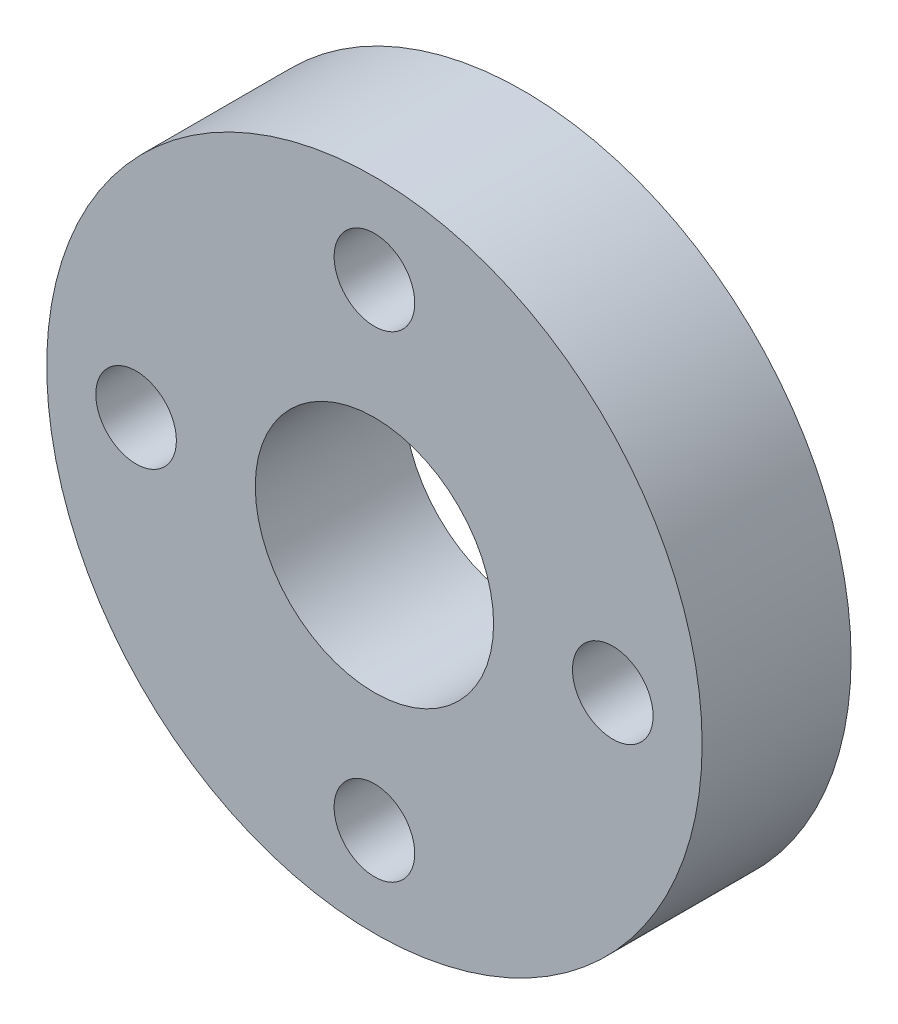
ISO-10303-21;
HEADER;
FILE_DESCRIPTION(('STEP AP214'),'2;1');
FILE_NAME('part.step','',(''),(''),'','','');
FILE_SCHEMA(('AUTOMOTIVE_DESIGN { 1 0 10303 214 1 1 1 1 }'));
ENDSEC;
DATA;
#1=APPLICATION_CONTEXT('core data for automotive mechanical design processes');
#2=APPLICATION_PROTOCOL_DEFINITION('international standard','automotive_design',2000,#1);
#3=PRODUCT_CONTEXT('',#1,'mechanical');
#4=PRODUCT('Part','Part','',(#3));
#5=PRODUCT_RELATED_PRODUCT_CATEGORY('part','',(#4));
#6=PRODUCT_DEFINITION_FORMATION('','',#4);
#7=PRODUCT_DEFINITION_CONTEXT('part definition',#1,'design');
#8=PRODUCT_DEFINITION('design','',#6,#7);
#9=PRODUCT_DEFINITION_SHAPE('','',#8);
#10=(LENGTH_UNIT() NAMED_UNIT(*) SI_UNIT(.MILLI.,.METRE.));
#11=(NAMED_UNIT(*) PLANE_ANGLE_UNIT() SI_UNIT($,.RADIAN.));
#12=(NAMED_UNIT(*) SI_UNIT($,.STERADIAN.) SOLID_ANGLE_UNIT());
#13=UNCERTAINTY_MEASURE_WITH_UNIT(LENGTH_MEASURE(1.E-05),#10,'distance_accuracy_value','');
#14=(GEOMETRIC_REPRESENTATION_CONTEXT(3) GLOBAL_UNCERTAINTY_ASSIGNED_CONTEXT((#13)) GLOBAL_UNIT_ASSIGNED_CONTEXT((#10,
#11,#12)) REPRESENTATION_CONTEXT('',''));
#15=CARTESIAN_POINT('',(0.,0.,0.));
#16=DIRECTION('',(0.,0.,1.));
#17=DIRECTION('',(1.,0.,0.));
#18=AXIS2_PLACEMENT_3D('',#15,#16,#17);
#19=CARTESIAN_POINT('',(0.,0.,2.5));
#20=DIRECTION('',(0.,0.,1.));
#21=DIRECTION('',(1.,0.,0.));
#22=AXIS2_PLACEMENT_3D('',#19,#20,#21);
#23=PLANE('',#22);
#24=CARTESIAN_POINT('',(-8.,0.,2.5));
#25=DIRECTION('',(0.,0.,1.));
#26=DIRECTION('',(1.,0.,0.));
#27=AXIS2_PLACEMENT_3D('',#24,#25,#26);
#28=CIRCLE('',#27,1.35255);
#29=CARTESIAN_POINT('',(-6.64745,0.,2.5));
#30=VERTEX_POINT('',#29);
#31=EDGE_CURVE('E71',#30,#30,#28,.T.);
#32=ORIENTED_EDGE('',*,*,#31,.F.);
#33=EDGE_LOOP('',(#32));
#34=FACE_BOUND('',#33,.T.);
#35=CARTESIAN_POINT('',(0.,-8.,2.5));
#36=DIRECTION('',(0.,0.,1.));
#37=DIRECTION('',(1.,0.,0.));
#38=AXIS2_PLACEMENT_3D('',#35,#36,#37);
#39=CIRCLE('',#38,1.35255);
#40=CARTESIAN_POINT('',(1.35255,-8.,2.5));
#41=VERTEX_POINT('',#40);
#42=EDGE_CURVE('E65',#41,#41,#39,.T.);
#43=ORIENTED_EDGE('',*,*,#42,.F.);
#44=EDGE_LOOP('',(#43));
#45=FACE_BOUND('',#44,.T.);
#46=CARTESIAN_POINT('',(8.,0.,2.5));
#47=DIRECTION('',(0.,0.,1.));
#48=DIRECTION('',(1.,0.,0.));
#49=AXIS2_PLACEMENT_3D('',#46,#47,#48);
#50=CIRCLE('',#49,1.35255);
#51=CARTESIAN_POINT('',(9.35255,0.,2.5));
#52=VERTEX_POINT('',#51);
#53=EDGE_CURVE('E59',#52,#52,#50,.T.);
#54=ORIENTED_EDGE('',*,*,#53,.F.);
#55=EDGE_LOOP('',(#54));
#56=FACE_BOUND('',#55,.T.);
#57=CARTESIAN_POINT('',(0.,8.,2.5));
#58=DIRECTION('',(0.,0.,1.));
#59=DIRECTION('',(1.,0.,0.));
#60=AXIS2_PLACEMENT_3D('',#57,#58,#59);
#61=CIRCLE('',#60,1.35255);
#62=CARTESIAN_POINT('',(1.35255,8.,2.5));
#63=VERTEX_POINT('',#62);
#64=EDGE_CURVE('E53',#63,#63,#61,.T.);
#65=ORIENTED_EDGE('',*,*,#64,.F.);
#66=EDGE_LOOP('',(#65));
#67=FACE_BOUND('',#66,.T.);
#68=CARTESIAN_POINT('',(0.,0.,2.5));
#69=DIRECTION('',(0.,0.,1.));
#70=DIRECTION('',(1.,0.,0.));
#71=AXIS2_PLACEMENT_3D('',#68,#69,#70);
#72=CIRCLE('',#71,11.);
#73=CARTESIAN_POINT('',(11.,0.,2.5));
#74=VERTEX_POINT('',#73);
#75=EDGE_CURVE('E10',#74,#74,#72,.T.);
#76=ORIENTED_EDGE('',*,*,#75,.T.);
#77=EDGE_LOOP('',(#76));
#78=FACE_BOUND('',#77,.T.);
#79=CARTESIAN_POINT('',(0.,0.,2.5));
#80=DIRECTION('',(0.,0.,1.));
#81=DIRECTION('',(1.,0.,0.));
#82=AXIS2_PLACEMENT_3D('',#79,#80,#81);
#83=CIRCLE('',#82,4.);
#84=CARTESIAN_POINT('',(4.,0.,2.5));
#85=VERTEX_POINT('',#84);
#86=EDGE_CURVE('E43',#85,#85,#83,.T.);
#87=ORIENTED_EDGE('',*,*,#86,.F.);
#88=EDGE_LOOP('',(#87));
#89=FACE_BOUND('',#88,.T.);
#90=ADVANCED_FACE('F32',(#34,#45,#56,#67,#78,#89),#23,.T.);
#91=CARTESIAN_POINT('',(0.,0.,-2.5));
#92=DIRECTION('',(0.,0.,1.));
#93=DIRECTION('',(1.,0.,0.));
#94=AXIS2_PLACEMENT_3D('',#91,#92,#93);
#95=PLANE('',#94);
#96=CARTESIAN_POINT('',(-8.,0.,-2.5));
#97=DIRECTION('',(0.,0.,1.));
#98=DIRECTION('',(1.,0.,0.));
#99=AXIS2_PLACEMENT_3D('',#96,#97,#98);
#100=CIRCLE('',#99,1.35255);
#101=CARTESIAN_POINT('',(-6.64745,0.,-2.5));
#102=VERTEX_POINT('',#101);
#103=EDGE_CURVE('E68',#102,#102,#100,.T.);
#104=ORIENTED_EDGE('',*,*,#103,.T.);
#105=EDGE_LOOP('',(#104));
#106=FACE_BOUND('',#105,.T.);
#107=CARTESIAN_POINT('',(0.,-8.,-2.5));
#108=DIRECTION('',(0.,0.,1.));
#109=DIRECTION('',(1.,0.,0.));
#110=AXIS2_PLACEMENT_3D('',#107,#108,#109);
#111=CIRCLE('',#110,1.35255);
#112=CARTESIAN_POINT('',(1.35255,-8.,-2.5));
#113=VERTEX_POINT('',#112);
#114=EDGE_CURVE('E62',#113,#113,#111,.T.);
#115=ORIENTED_EDGE('',*,*,#114,.T.);
#116=EDGE_LOOP('',(#115));
#117=FACE_BOUND('',#116,.T.);
#118=CARTESIAN_POINT('',(8.,0.,-2.5));
#119=DIRECTION('',(0.,0.,1.));
#120=DIRECTION('',(1.,0.,0.));
#121=AXIS2_PLACEMENT_3D('',#118,#119,#120);
#122=CIRCLE('',#121,1.35255);
#123=CARTESIAN_POINT('',(9.35255,0.,-2.5));
#124=VERTEX_POINT('',#123);
#125=EDGE_CURVE('E56',#124,#124,#122,.T.);
#126=ORIENTED_EDGE('',*,*,#125,.T.);
#127=EDGE_LOOP('',(#126));
#128=FACE_BOUND('',#127,.T.);
#129=CARTESIAN_POINT('',(0.,8.,-2.5));
#130=DIRECTION('',(0.,0.,1.));
#131=DIRECTION('',(1.,0.,0.));
#132=AXIS2_PLACEMENT_3D('',#129,#130,#131);
#133=CIRCLE('',#132,1.35255);
#134=CARTESIAN_POINT('',(1.35255,8.,-2.5));
#135=VERTEX_POINT('',#134);
#136=EDGE_CURVE('E48',#135,#135,#133,.T.);
#137=ORIENTED_EDGE('',*,*,#136,.T.);
#138=EDGE_LOOP('',(#137));
#139=FACE_BOUND('',#138,.T.);
#140=CARTESIAN_POINT('',(0.,0.,-2.5));
#141=DIRECTION('',(0.,0.,1.));
#142=DIRECTION('',(1.,0.,0.));
#143=AXIS2_PLACEMENT_3D('',#140,#141,#142);
#144=CIRCLE('',#143,11.);
#145=CARTESIAN_POINT('',(11.,0.,-2.5));
#146=VERTEX_POINT('',#145);
#147=EDGE_CURVE('E36',#146,#146,#144,.T.);
#148=ORIENTED_EDGE('',*,*,#147,.F.);
#149=EDGE_LOOP('',(#148));
#150=FACE_BOUND('',#149,.T.);
#151=CARTESIAN_POINT('',(0.,0.,-2.5));
#152=DIRECTION('',(0.,0.,1.));
#153=DIRECTION('',(1.,0.,0.));
#154=AXIS2_PLACEMENT_3D('',#151,#152,#153);
#155=CIRCLE('',#154,4.);
#156=CARTESIAN_POINT('',(4.,0.,-2.5));
#157=VERTEX_POINT('',#156);
#158=EDGE_CURVE('E45',#157,#157,#155,.T.);
#159=ORIENTED_EDGE('',*,*,#158,.T.);
#160=EDGE_LOOP('',(#159));
#161=FACE_BOUND('',#160,.T.);
#162=ADVANCED_FACE('F79',(#106,#117,#128,#139,#150,#161),#95,.F.);
#163=CARTESIAN_POINT('',(0.,0.,2.5));
#164=DIRECTION('',(0.,0.,-1.));
#165=DIRECTION('',(-1.,0.,0.));
#166=AXIS2_PLACEMENT_3D('',#163,#164,#165);
#167=CYLINDRICAL_SURFACE('',#166,11.);
#168=ORIENTED_EDGE('',*,*,#75,.F.);
#169=EDGE_LOOP('',(#168));
#170=FACE_BOUND('',#169,.T.);
#171=ORIENTED_EDGE('',*,*,#147,.T.);
#172=EDGE_LOOP('',(#171));
#173=FACE_BOUND('',#172,.T.);
#174=ADVANCED_FACE('F34',(#170,#173),#167,.T.);
#175=CARTESIAN_POINT('',(0.,0.,2.5));
#176=DIRECTION('',(0.,0.,-1.));
#177=DIRECTION('',(-1.,0.,0.));
#178=AXIS2_PLACEMENT_3D('',#175,#176,#177);
#179=CYLINDRICAL_SURFACE('',#178,4.);
#180=ORIENTED_EDGE('',*,*,#86,.T.);
#181=EDGE_LOOP('',(#180));
#182=FACE_BOUND('',#181,.T.);
#183=ORIENTED_EDGE('',*,*,#158,.F.);
#184=EDGE_LOOP('',(#183));
#185=FACE_BOUND('',#184,.T.);
#186=ADVANCED_FACE('F89',(#182,#185),#179,.F.);
#187=CARTESIAN_POINT('',(0.,8.,2.5));
#188=DIRECTION('',(0.,0.,1.));
#189=DIRECTION('',(1.,0.,0.));
#190=AXIS2_PLACEMENT_3D('',#187,#188,#189);
#191=CYLINDRICAL_SURFACE('',#190,1.35255);
#192=ORIENTED_EDGE('',*,*,#136,.F.);
#193=EDGE_LOOP('',(#192));
#194=FACE_BOUND('',#193,.T.);
#195=ORIENTED_EDGE('',*,*,#64,.T.);
#196=EDGE_LOOP('',(#195));
#197=FACE_BOUND('',#196,.T.);
#198=ADVANCED_FACE('F92',(#194,#197),#191,.F.);
#199=CARTESIAN_POINT('',(8.,0.,2.5));
#200=DIRECTION('',(0.,0.,1.));
#201=DIRECTION('',(1.,0.,0.));
#202=AXIS2_PLACEMENT_3D('',#199,#200,#201);
#203=CYLINDRICAL_SURFACE('',#202,1.35255);
#204=ORIENTED_EDGE('',*,*,#125,.F.);
#205=EDGE_LOOP('',(#204));
#206=FACE_BOUND('',#205,.T.);
#207=ORIENTED_EDGE('',*,*,#53,.T.);
#208=EDGE_LOOP('',(#207));
#209=FACE_BOUND('',#208,.T.);
#210=ADVANCED_FACE('F106',(#206,#209),#203,.F.);
#211=CARTESIAN_POINT('',(0.,-8.,2.5));
#212=DIRECTION('',(0.,0.,1.));
#213=DIRECTION('',(1.,0.,0.));
#214=AXIS2_PLACEMENT_3D('',#211,#212,#213);
#215=CYLINDRICAL_SURFACE('',#214,1.35255);
#216=ORIENTED_EDGE('',*,*,#114,.F.);
#217=EDGE_LOOP('',(#216));
#218=FACE_BOUND('',#217,.T.);
#219=ORIENTED_EDGE('',*,*,#42,.T.);
#220=EDGE_LOOP('',(#219));
#221=FACE_BOUND('',#220,.T.);
#222=ADVANCED_FACE('F110',(#218,#221),#215,.F.);
#223=CARTESIAN_POINT('',(-8.,0.,2.5));
#224=DIRECTION('',(0.,0.,1.));
#225=DIRECTION('',(1.,0.,0.));
#226=AXIS2_PLACEMENT_3D('',#223,#224,#225);
#227=CYLINDRICAL_SURFACE('',#226,1.35255);
#228=ORIENTED_EDGE('',*,*,#103,.F.);
#229=EDGE_LOOP('',(#228));
#230=FACE_BOUND('',#229,.T.);
#231=ORIENTED_EDGE('',*,*,#31,.T.);
#232=EDGE_LOOP('',(#231));
#233=FACE_BOUND('',#232,.T.);
#234=ADVANCED_FACE('F75',(#230,#233),#227,.F.);
#235=CLOSED_SHELL('',(#90,#162,#174,#186,#198,#210,#222,#234));
#236=MANIFOLD_SOLID_BREP('B2',#235);
#237=ADVANCED_BREP_SHAPE_REPRESENTATION('',(#18,#236),#14);
#238=SHAPE_DEFINITION_REPRESENTATION(#9,#237);
ENDSEC;
END-ISO-10303-21;
